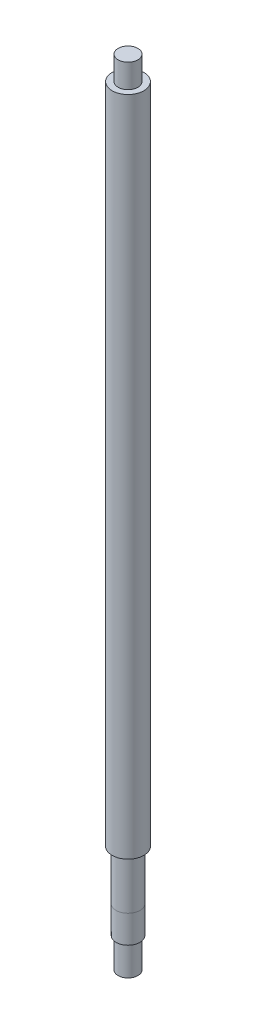
ISO-10303-21;
HEADER;
FILE_DESCRIPTION(('STEP AP214'),'2;1');
FILE_NAME('part.step','',(''),(''),'','','');
FILE_SCHEMA(('AUTOMOTIVE_DESIGN { 1 0 10303 214 1 1 1 1 }'));
ENDSEC;
DATA;
#1=APPLICATION_CONTEXT('core data for automotive mechanical design processes');
#2=APPLICATION_PROTOCOL_DEFINITION('international standard','automotive_design',2000,#1);
#3=PRODUCT_CONTEXT('',#1,'mechanical');
#4=PRODUCT('Part','Part','',(#3));
#5=PRODUCT_RELATED_PRODUCT_CATEGORY('part','',(#4));
#6=PRODUCT_DEFINITION_FORMATION('','',#4);
#7=PRODUCT_DEFINITION_CONTEXT('part definition',#1,'design');
#8=PRODUCT_DEFINITION('design','',#6,#7);
#9=PRODUCT_DEFINITION_SHAPE('','',#8);
#10=(LENGTH_UNIT() NAMED_UNIT(*) SI_UNIT(.MILLI.,.METRE.));
#11=(NAMED_UNIT(*) PLANE_ANGLE_UNIT() SI_UNIT($,.RADIAN.));
#12=(NAMED_UNIT(*) SI_UNIT($,.STERADIAN.) SOLID_ANGLE_UNIT());
#13=UNCERTAINTY_MEASURE_WITH_UNIT(LENGTH_MEASURE(1.E-05),#10,'distance_accuracy_value','');
#14=(GEOMETRIC_REPRESENTATION_CONTEXT(3) GLOBAL_UNCERTAINTY_ASSIGNED_CONTEXT((#13)) GLOBAL_UNIT_ASSIGNED_CONTEXT((#10,
#11,#12)) REPRESENTATION_CONTEXT('',''));
#15=CARTESIAN_POINT('',(0.,0.,0.));
#16=DIRECTION('',(0.,0.,1.));
#17=DIRECTION('',(1.,0.,0.));
#18=AXIS2_PLACEMENT_3D('',#15,#16,#17);
#19=CARTESIAN_POINT('',(0.,372.899,0.));
#20=DIRECTION('',(0.,1.,0.));
#21=DIRECTION('',(0.,0.,1.));
#22=AXIS2_PLACEMENT_3D('',#19,#20,#21);
#23=PLANE('',#22);
#24=CARTESIAN_POINT('',(0.,372.899,0.));
#25=DIRECTION('',(0.,1.,0.));
#26=DIRECTION('',(0.,0.,1.));
#27=AXIS2_PLACEMENT_3D('',#24,#25,#26);
#28=CIRCLE('',#27,8.);
#29=CARTESIAN_POINT('',(0.,372.899,8.));
#30=VERTEX_POINT('',#29);
#31=EDGE_CURVE('E60',#30,#30,#28,.T.);
#32=ORIENTED_EDGE('',*,*,#31,.T.);
#33=EDGE_LOOP('',(#32));
#34=FACE_BOUND('',#33,.T.);
#35=CARTESIAN_POINT('',(0.,372.899,0.));
#36=DIRECTION('',(0.,1.,0.));
#37=DIRECTION('',(0.,0.,1.));
#38=AXIS2_PLACEMENT_3D('',#35,#36,#37);
#39=CIRCLE('',#38,5.);
#40=CARTESIAN_POINT('',(0.,372.899,-5.));
#41=VERTEX_POINT('',#40);
#42=EDGE_CURVE('E66',#41,#41,#39,.T.);
#43=ORIENTED_EDGE('',*,*,#42,.F.);
#44=EDGE_LOOP('',(#43));
#45=FACE_BOUND('',#44,.T.);
#46=ADVANCED_FACE('F35',(#34,#45),#23,.T.);
#47=CARTESIAN_POINT('',(0.,400.,0.));
#48=DIRECTION('',(0.,-1.,0.));
#49=DIRECTION('',(0.,0.,-1.));
#50=AXIS2_PLACEMENT_3D('',#47,#48,#49);
#51=CYLINDRICAL_SURFACE('',#50,8.);
#52=CARTESIAN_POINT('',(0.,39.,0.));
#53=DIRECTION('',(0.,-1.,0.));
#54=DIRECTION('',(0.,0.,-1.));
#55=AXIS2_PLACEMENT_3D('',#52,#53,#54);
#56=CIRCLE('',#55,8.);
#57=CARTESIAN_POINT('',(0.,39.,-8.));
#58=VERTEX_POINT('',#57);
#59=EDGE_CURVE('E46',#58,#58,#56,.T.);
#60=ORIENTED_EDGE('',*,*,#59,.F.);
#61=EDGE_LOOP('',(#60));
#62=FACE_BOUND('',#61,.T.);
#63=ORIENTED_EDGE('',*,*,#31,.F.);
#64=EDGE_LOOP('',(#63));
#65=FACE_BOUND('',#64,.T.);
#66=ADVANCED_FACE('F37',(#62,#65),#51,.T.);
#67=CARTESIAN_POINT('',(0.,0.,0.));
#68=DIRECTION('',(0.,-1.,0.));
#69=DIRECTION('',(0.,0.,-1.));
#70=AXIS2_PLACEMENT_3D('',#67,#68,#69);
#71=PLANE('',#70);
#72=CARTESIAN_POINT('',(0.,0.,0.));
#73=DIRECTION('',(0.,-1.,0.));
#74=DIRECTION('',(0.,0.,-1.));
#75=AXIS2_PLACEMENT_3D('',#72,#73,#74);
#76=CIRCLE('',#75,6.);
#77=CARTESIAN_POINT('',(0.,0.,-6.));
#78=VERTEX_POINT('',#77);
#79=EDGE_CURVE('E39',#78,#78,#76,.T.);
#80=ORIENTED_EDGE('',*,*,#79,.T.);
#81=EDGE_LOOP('',(#80));
#82=FACE_BOUND('',#81,.T.);
#83=CARTESIAN_POINT('',(0.,0.,0.));
#84=DIRECTION('',(0.,-1.,0.));
#85=DIRECTION('',(0.,0.,-1.));
#86=AXIS2_PLACEMENT_3D('',#83,#84,#85);
#87=CIRCLE('',#86,5.);
#88=CARTESIAN_POINT('',(0.,0.,-5.));
#89=VERTEX_POINT('',#88);
#90=EDGE_CURVE('E57',#89,#89,#87,.T.);
#91=ORIENTED_EDGE('',*,*,#90,.F.);
#92=EDGE_LOOP('',(#91));
#93=FACE_BOUND('',#92,.T.);
#94=ADVANCED_FACE('F87',(#82,#93),#71,.T.);
#95=CARTESIAN_POINT('',(0.,14.,0.));
#96=DIRECTION('',(0.,-1.,0.));
#97=DIRECTION('',(0.,0.,-1.));
#98=AXIS2_PLACEMENT_3D('',#95,#96,#97);
#99=PLANE('',#98);
#100=CARTESIAN_POINT('',(0.,14.,0.));
#101=DIRECTION('',(0.,-1.,0.));
#102=DIRECTION('',(0.,0.,-1.));
#103=AXIS2_PLACEMENT_3D('',#100,#101,#102);
#104=CIRCLE('',#103,6.);
#105=CARTESIAN_POINT('',(0.,14.,-6.));
#106=VERTEX_POINT('',#105);
#107=EDGE_CURVE('E10',#106,#106,#104,.T.);
#108=ORIENTED_EDGE('',*,*,#107,.F.);
#109=EDGE_LOOP('',(#108));
#110=FACE_BOUND('',#109,.T.);
#111=CARTESIAN_POINT('',(0.,14.,0.));
#112=DIRECTION('',(0.,-1.,0.));
#113=DIRECTION('',(0.,0.,-1.));
#114=AXIS2_PLACEMENT_3D('',#111,#112,#113);
#115=CIRCLE('',#114,6.05);
#116=CARTESIAN_POINT('',(0.,14.,-6.05));
#117=VERTEX_POINT('',#116);
#118=EDGE_CURVE('E48',#117,#117,#115,.T.);
#119=ORIENTED_EDGE('',*,*,#118,.T.);
#120=EDGE_LOOP('',(#119));
#121=FACE_BOUND('',#120,.T.);
#122=ADVANCED_FACE('F107',(#110,#121),#99,.T.);
#123=CARTESIAN_POINT('',(0.,14.,0.));
#124=DIRECTION('',(0.,-1.,0.));
#125=DIRECTION('',(0.,0.,-1.));
#126=AXIS2_PLACEMENT_3D('',#123,#124,#125);
#127=CYLINDRICAL_SURFACE('',#126,6.);
#128=ORIENTED_EDGE('',*,*,#107,.T.);
#129=EDGE_LOOP('',(#128));
#130=FACE_BOUND('',#129,.T.);
#131=ORIENTED_EDGE('',*,*,#79,.F.);
#132=EDGE_LOOP('',(#131));
#133=FACE_BOUND('',#132,.T.);
#134=ADVANCED_FACE('F105',(#130,#133),#127,.T.);
#135=CARTESIAN_POINT('',(0.,39.,0.));
#136=DIRECTION('',(0.,-1.,0.));
#137=DIRECTION('',(0.,0.,-1.));
#138=AXIS2_PLACEMENT_3D('',#135,#136,#137);
#139=CYLINDRICAL_SURFACE('',#138,6.05);
#140=CARTESIAN_POINT('',(0.,39.,0.));
#141=DIRECTION('',(0.,-1.,0.));
#142=DIRECTION('',(0.,0.,-1.));
#143=AXIS2_PLACEMENT_3D('',#140,#141,#142);
#144=CIRCLE('',#143,6.05);
#145=CARTESIAN_POINT('',(0.,39.,-6.05));
#146=VERTEX_POINT('',#145);
#147=EDGE_CURVE('E51',#146,#146,#144,.T.);
#148=ORIENTED_EDGE('',*,*,#147,.T.);
#149=EDGE_LOOP('',(#148));
#150=FACE_BOUND('',#149,.T.);
#151=ORIENTED_EDGE('',*,*,#118,.F.);
#152=EDGE_LOOP('',(#151));
#153=FACE_BOUND('',#152,.T.);
#154=ADVANCED_FACE('F101',(#150,#153),#139,.T.);
#155=CARTESIAN_POINT('',(0.,39.,0.));
#156=DIRECTION('',(0.,-1.,0.));
#157=DIRECTION('',(0.,0.,-1.));
#158=AXIS2_PLACEMENT_3D('',#155,#156,#157);
#159=PLANE('',#158);
#160=ORIENTED_EDGE('',*,*,#147,.F.);
#161=EDGE_LOOP('',(#160));
#162=FACE_BOUND('',#161,.T.);
#163=ORIENTED_EDGE('',*,*,#59,.T.);
#164=EDGE_LOOP('',(#163));
#165=FACE_BOUND('',#164,.T.);
#166=ADVANCED_FACE('F97',(#162,#165),#159,.T.);
#167=CARTESIAN_POINT('',(0.,-15.,0.));
#168=DIRECTION('',(0.,1.,0.));
#169=DIRECTION('',(0.,0.,1.));
#170=AXIS2_PLACEMENT_3D('',#167,#168,#169);
#171=CYLINDRICAL_SURFACE('',#170,5.);
#172=CARTESIAN_POINT('',(0.,-15.,0.));
#173=DIRECTION('',(0.,-1.,0.));
#174=DIRECTION('',(0.,0.,-1.));
#175=AXIS2_PLACEMENT_3D('',#172,#173,#174);
#176=CIRCLE('',#175,5.);
#177=CARTESIAN_POINT('',(0.,-15.,-5.));
#178=VERTEX_POINT('',#177);
#179=EDGE_CURVE('E52',#178,#178,#176,.T.);
#180=ORIENTED_EDGE('',*,*,#179,.F.);
#181=EDGE_LOOP('',(#180));
#182=FACE_BOUND('',#181,.T.);
#183=ORIENTED_EDGE('',*,*,#90,.T.);
#184=EDGE_LOOP('',(#183));
#185=FACE_BOUND('',#184,.T.);
#186=ADVANCED_FACE('F93',(#182,#185),#171,.T.);
#187=CARTESIAN_POINT('',(0.,-15.,0.));
#188=DIRECTION('',(0.,-1.,0.));
#189=DIRECTION('',(0.,0.,-1.));
#190=AXIS2_PLACEMENT_3D('',#187,#188,#189);
#191=PLANE('',#190);
#192=ORIENTED_EDGE('',*,*,#179,.T.);
#193=EDGE_LOOP('',(#192));
#194=FACE_BOUND('',#193,.T.);
#195=ADVANCED_FACE('F77',(#194),#191,.T.);
#196=CARTESIAN_POINT('',(0.,384.899,0.));
#197=DIRECTION('',(0.,-1.,0.));
#198=DIRECTION('',(0.,0.,-1.));
#199=AXIS2_PLACEMENT_3D('',#196,#197,#198);
#200=CYLINDRICAL_SURFACE('',#199,5.);
#201=CARTESIAN_POINT('',(0.,384.899,0.));
#202=DIRECTION('',(0.,1.,0.));
#203=DIRECTION('',(0.,0.,1.));
#204=AXIS2_PLACEMENT_3D('',#201,#202,#203);
#205=CIRCLE('',#204,5.);
#206=CARTESIAN_POINT('',(0.,384.899,-5.));
#207=VERTEX_POINT('',#206);
#208=EDGE_CURVE('E65',#207,#207,#205,.T.);
#209=CARTESIAN_POINT('',(0.,384.899,-5.));
#210=CARTESIAN_POINT('',(0.,384.774,-5.));
#211=CARTESIAN_POINT('',(0.,384.649,-5.));
#212=CARTESIAN_POINT('',(0.,384.399,-5.));
#213=CARTESIAN_POINT('',(0.,384.274,-5.));
#214=CARTESIAN_POINT('',(0.,384.024,-5.));
#215=CARTESIAN_POINT('',(0.,383.899,-5.));
#216=CARTESIAN_POINT('',(0.,383.649,-5.));
#217=CARTESIAN_POINT('',(0.,383.524,-5.));
#218=CARTESIAN_POINT('',(0.,383.274,-5.));
#219=CARTESIAN_POINT('',(0.,383.149,-5.));
#220=CARTESIAN_POINT('',(0.,382.899,-5.));
#221=CARTESIAN_POINT('',(0.,382.774,-5.));
#222=CARTESIAN_POINT('',(0.,382.524,-5.));
#223=CARTESIAN_POINT('',(0.,382.399,-5.));
#224=CARTESIAN_POINT('',(0.,382.149,-5.));
#225=CARTESIAN_POINT('',(0.,382.024,-5.));
#226=CARTESIAN_POINT('',(0.,381.774,-5.));
#227=CARTESIAN_POINT('',(0.,381.649,-5.));
#228=CARTESIAN_POINT('',(0.,381.399,-5.));
#229=CARTESIAN_POINT('',(0.,381.274,-5.));
#230=CARTESIAN_POINT('',(0.,381.024,-5.));
#231=CARTESIAN_POINT('',(0.,380.899,-5.));
#232=CARTESIAN_POINT('',(0.,380.649,-5.));
#233=CARTESIAN_POINT('',(0.,380.524,-5.));
#234=CARTESIAN_POINT('',(0.,380.274,-5.));
#235=CARTESIAN_POINT('',(0.,380.149,-5.));
#236=CARTESIAN_POINT('',(0.,379.899,-5.));
#237=CARTESIAN_POINT('',(0.,379.774,-5.));
#238=CARTESIAN_POINT('',(0.,379.524,-5.));
#239=CARTESIAN_POINT('',(0.,379.399,-5.));
#240=CARTESIAN_POINT('',(0.,379.149,-5.));
#241=CARTESIAN_POINT('',(0.,379.024,-5.));
#242=CARTESIAN_POINT('',(0.,378.774,-5.));
#243=CARTESIAN_POINT('',(0.,378.649,-5.));
#244=CARTESIAN_POINT('',(0.,378.399,-5.));
#245=CARTESIAN_POINT('',(0.,378.274,-5.));
#246=CARTESIAN_POINT('',(0.,378.024,-5.));
#247=CARTESIAN_POINT('',(0.,377.899,-5.));
#248=CARTESIAN_POINT('',(0.,377.649,-5.));
#249=CARTESIAN_POINT('',(0.,377.524,-5.));
#250=CARTESIAN_POINT('',(0.,377.274,-5.));
#251=CARTESIAN_POINT('',(0.,377.149,-5.));
#252=CARTESIAN_POINT('',(0.,376.899,-5.));
#253=CARTESIAN_POINT('',(0.,376.774,-5.));
#254=CARTESIAN_POINT('',(0.,376.524,-5.));
#255=CARTESIAN_POINT('',(0.,376.399,-5.));
#256=CARTESIAN_POINT('',(0.,376.149,-5.));
#257=CARTESIAN_POINT('',(0.,376.024,-5.));
#258=CARTESIAN_POINT('',(0.,375.774,-5.));
#259=CARTESIAN_POINT('',(0.,375.649,-5.));
#260=CARTESIAN_POINT('',(0.,375.399,-5.));
#261=CARTESIAN_POINT('',(0.,375.274,-5.));
#262=CARTESIAN_POINT('',(0.,375.024,-5.));
#263=CARTESIAN_POINT('',(0.,374.899,-5.));
#264=CARTESIAN_POINT('',(0.,374.649,-5.));
#265=CARTESIAN_POINT('',(0.,374.524,-5.));
#266=CARTESIAN_POINT('',(0.,374.274,-5.));
#267=CARTESIAN_POINT('',(0.,374.149,-5.));
#268=CARTESIAN_POINT('',(0.,373.899,-5.));
#269=CARTESIAN_POINT('',(0.,373.774,-5.));
#270=CARTESIAN_POINT('',(0.,373.524,-5.));
#271=CARTESIAN_POINT('',(0.,373.399,-5.));
#272=CARTESIAN_POINT('',(0.,373.149,-5.));
#273=CARTESIAN_POINT('',(0.,373.024,-5.));
#274=CARTESIAN_POINT('',(0.,372.899,-5.));
#275=B_SPLINE_CURVE_WITH_KNOTS('',3,(#209,#210,#211,#212,#213,#214,#215,#216,#217,#218,#219,
#220,#221,#222,#223,#224,#225,#226,#227,#228,#229,#230,#231,#232,#233,#234,#235,#236,#237,#238,
#239,#240,#241,#242,#243,#244,#245,#246,#247,#248,#249,#250,#251,#252,#253,#254,#255,#256,#257,
#258,#259,#260,#261,#262,#263,#264,#265,#266,#267,#268,#269,#270,#271,#272,#273,#274),
.UNSPECIFIED.,.F.,.F.,(4,2,2,2,2,2,2,2,2,2,2,2,2,2,2,2,2,2,2,2,2,2,2,2,2,2,2,2,2,2,2,2,4),(0.,
0.375000000000014,0.750000000000028,1.12500000000004,1.5,1.87500000000002,2.25000000000003,
2.62500000000004,3.,3.37500000000002,3.75000000000003,4.12500000000005,4.5,4.87500000000002,
5.25000000000003,5.62500000000005,6.00000000000001,6.37500000000002,6.75000000000003,
7.12500000000005,7.50000000000001,7.87500000000002,8.25000000000004,8.62500000000005,
9.00000000000001,9.37500000000002,9.75000000000004,10.125,10.5,10.875,11.25,11.6250000000001,
12.),.UNSPECIFIED.);
#276=EDGE_CURVE('BSEAM74',#207,#41,#275,.T.);
#277=ORIENTED_EDGE('',*,*,#208,.F.);
#278=ORIENTED_EDGE('',*,*,#42,.T.);
#279=ORIENTED_EDGE('',*,*,#276,.T.);
#280=ORIENTED_EDGE('',*,*,#276,.F.);
#281=EDGE_LOOP('',(#277,#279,#278,#280));
#282=FACE_BOUND('',#281,.T.);
#283=ADVANCED_FACE('F74',(#282),#200,.T.);
#284=CARTESIAN_POINT('',(0.,384.899,0.));
#285=DIRECTION('',(0.,1.,0.));
#286=DIRECTION('',(0.,0.,1.));
#287=AXIS2_PLACEMENT_3D('',#284,#285,#286);
#288=PLANE('',#287);
#289=ORIENTED_EDGE('',*,*,#208,.T.);
#290=EDGE_LOOP('',(#289));
#291=FACE_BOUND('',#290,.T.);
#292=ADVANCED_FACE('F72',(#291),#288,.T.);
#293=CLOSED_SHELL('',(#46,#66,#94,#122,#134,#154,#166,#186,#195,#283,#292));
#294=MANIFOLD_SOLID_BREP('B2',#293);
#295=ADVANCED_BREP_SHAPE_REPRESENTATION('',(#18,#294),#14);
#296=SHAPE_DEFINITION_REPRESENTATION(#9,#295);
ENDSEC;
END-ISO-10303-21;
